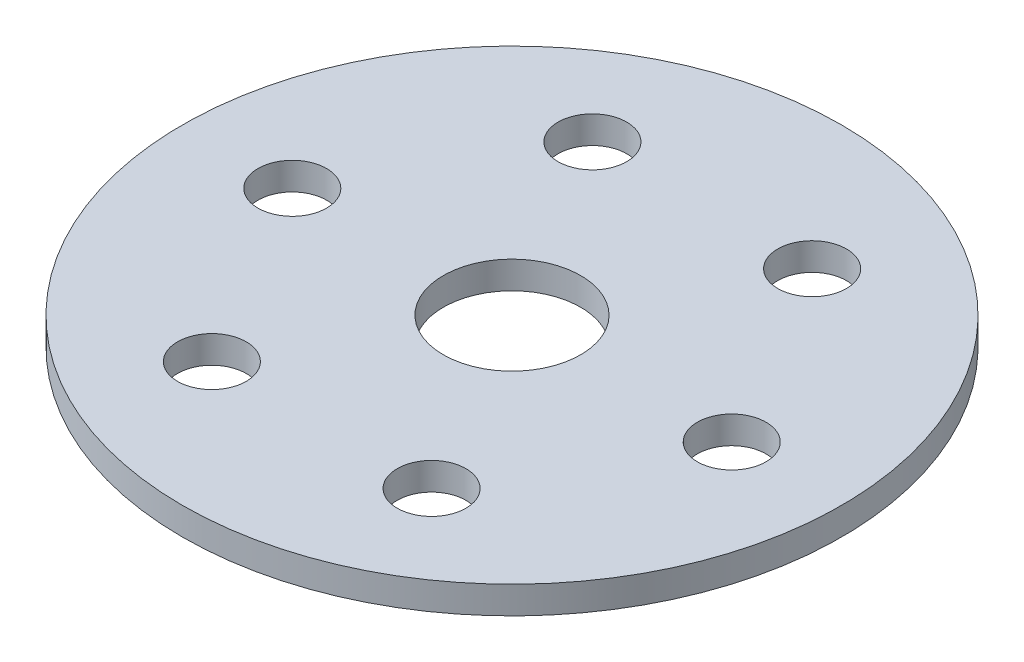
ISO-10303-21;
HEADER;
FILE_DESCRIPTION(('STEP AP214'),'2;1');
FILE_NAME('part.step','',(''),(''),'','','');
FILE_SCHEMA(('AUTOMOTIVE_DESIGN { 1 0 10303 214 1 1 1 1 }'));
ENDSEC;
DATA;
#1=APPLICATION_CONTEXT('core data for automotive mechanical design processes');
#2=APPLICATION_PROTOCOL_DEFINITION('international standard','automotive_design',2000,#1);
#3=PRODUCT_CONTEXT('',#1,'mechanical');
#4=PRODUCT('Part','Part','',(#3));
#5=PRODUCT_RELATED_PRODUCT_CATEGORY('part','',(#4));
#6=PRODUCT_DEFINITION_FORMATION('','',#4);
#7=PRODUCT_DEFINITION_CONTEXT('part definition',#1,'design');
#8=PRODUCT_DEFINITION('design','',#6,#7);
#9=PRODUCT_DEFINITION_SHAPE('','',#8);
#10=(LENGTH_UNIT() NAMED_UNIT(*) SI_UNIT(.MILLI.,.METRE.));
#11=(NAMED_UNIT(*) PLANE_ANGLE_UNIT() SI_UNIT($,.RADIAN.));
#12=(NAMED_UNIT(*) SI_UNIT($,.STERADIAN.) SOLID_ANGLE_UNIT());
#13=UNCERTAINTY_MEASURE_WITH_UNIT(LENGTH_MEASURE(1.E-05),#10,'distance_accuracy_value','');
#14=(GEOMETRIC_REPRESENTATION_CONTEXT(3) GLOBAL_UNCERTAINTY_ASSIGNED_CONTEXT((#13)) GLOBAL_UNIT_ASSIGNED_CONTEXT((#10,
#11,#12)) REPRESENTATION_CONTEXT('',''));
#15=CARTESIAN_POINT('',(0.,0.,0.));
#16=DIRECTION('',(0.,0.,1.));
#17=DIRECTION('',(1.,0.,0.));
#18=AXIS2_PLACEMENT_3D('',#15,#16,#17);
#19=CARTESIAN_POINT('',(0.,6.35,0.));
#20=DIRECTION('',(0.,1.,0.));
#21=DIRECTION('',(0.,0.,1.));
#22=AXIS2_PLACEMENT_3D('',#19,#20,#21);
#23=PLANE('',#22);
#24=CARTESIAN_POINT('',(-25.4000000000005,6.35,-43.9940905122492));
#25=DIRECTION('',(0.,1.,0.));
#26=DIRECTION('',(0.,0.,1.));
#27=AXIS2_PLACEMENT_3D('',#24,#25,#26);
#28=CIRCLE('',#27,7.9375);
#29=CARTESIAN_POINT('',(-25.4000000000005,6.35,-36.0565905122492));
#30=VERTEX_POINT('',#29);
#31=EDGE_CURVE('E83',#30,#30,#28,.T.);
#32=ORIENTED_EDGE('',*,*,#31,.F.);
#33=EDGE_LOOP('',(#32));
#34=FACE_BOUND('',#33,.T.);
#35=CARTESIAN_POINT('',(25.3999999999996,6.35,-43.9940905122497));
#36=DIRECTION('',(0.,1.,0.));
#37=DIRECTION('',(0.,0.,1.));
#38=AXIS2_PLACEMENT_3D('',#35,#36,#37);
#39=CIRCLE('',#38,7.9375);
#40=CARTESIAN_POINT('',(25.3999999999996,6.35,-36.0565905122497));
#41=VERTEX_POINT('',#40);
#42=EDGE_CURVE('E77',#41,#41,#39,.T.);
#43=ORIENTED_EDGE('',*,*,#42,.F.);
#44=EDGE_LOOP('',(#43));
#45=FACE_BOUND('',#44,.T.);
#46=CARTESIAN_POINT('',(50.8,6.35,0.));
#47=DIRECTION('',(0.,1.,0.));
#48=DIRECTION('',(0.,0.,1.));
#49=AXIS2_PLACEMENT_3D('',#46,#47,#48);
#50=CIRCLE('',#49,7.9375);
#51=CARTESIAN_POINT('',(50.8,6.35,7.9375));
#52=VERTEX_POINT('',#51);
#53=EDGE_CURVE('E71',#52,#52,#50,.T.);
#54=ORIENTED_EDGE('',*,*,#53,.F.);
#55=EDGE_LOOP('',(#54));
#56=FACE_BOUND('',#55,.T.);
#57=CARTESIAN_POINT('',(25.4000000000002,6.35,43.9940905122494));
#58=DIRECTION('',(0.,1.,0.));
#59=DIRECTION('',(0.,0.,1.));
#60=AXIS2_PLACEMENT_3D('',#57,#58,#59);
#61=CIRCLE('',#60,7.9375);
#62=CARTESIAN_POINT('',(25.4000000000002,6.35,51.9315905122494));
#63=VERTEX_POINT('',#62);
#64=EDGE_CURVE('E65',#63,#63,#61,.T.);
#65=ORIENTED_EDGE('',*,*,#64,.F.);
#66=EDGE_LOOP('',(#65));
#67=FACE_BOUND('',#66,.T.);
#68=CARTESIAN_POINT('',(-25.3999999999999,6.35,43.9940905122495));
#69=DIRECTION('',(0.,1.,0.));
#70=DIRECTION('',(0.,0.,1.));
#71=AXIS2_PLACEMENT_3D('',#68,#69,#70);
#72=CIRCLE('',#71,7.9375);
#73=CARTESIAN_POINT('',(-25.3999999999999,6.35,51.9315905122495));
#74=VERTEX_POINT('',#73);
#75=EDGE_CURVE('E59',#74,#74,#72,.T.);
#76=ORIENTED_EDGE('',*,*,#75,.F.);
#77=EDGE_LOOP('',(#76));
#78=FACE_BOUND('',#77,.T.);
#79=CARTESIAN_POINT('',(-50.8,6.35,0.));
#80=DIRECTION('',(0.,1.,0.));
#81=DIRECTION('',(0.,0.,1.));
#82=AXIS2_PLACEMENT_3D('',#79,#80,#81);
#83=CIRCLE('',#82,7.9375);
#84=CARTESIAN_POINT('',(-50.8,6.35,7.9375));
#85=VERTEX_POINT('',#84);
#86=EDGE_CURVE('E53',#85,#85,#83,.T.);
#87=ORIENTED_EDGE('',*,*,#86,.F.);
#88=EDGE_LOOP('',(#87));
#89=FACE_BOUND('',#88,.T.);
#90=CARTESIAN_POINT('',(0.,6.35,0.));
#91=DIRECTION('',(0.,1.,0.));
#92=DIRECTION('',(0.,0.,1.));
#93=AXIS2_PLACEMENT_3D('',#90,#91,#92);
#94=CIRCLE('',#93,76.2);
#95=CARTESIAN_POINT('',(0.,6.35,76.2));
#96=VERTEX_POINT('',#95);
#97=EDGE_CURVE('E10',#96,#96,#94,.T.);
#98=ORIENTED_EDGE('',*,*,#97,.T.);
#99=EDGE_LOOP('',(#98));
#100=FACE_BOUND('',#99,.T.);
#101=CARTESIAN_POINT('',(0.,6.35,0.));
#102=DIRECTION('',(0.,1.,0.));
#103=DIRECTION('',(0.,0.,1.));
#104=AXIS2_PLACEMENT_3D('',#101,#102,#103);
#105=CIRCLE('',#104,15.875);
#106=CARTESIAN_POINT('',(0.,6.35,15.875));
#107=VERTEX_POINT('',#106);
#108=EDGE_CURVE('E43',#107,#107,#105,.T.);
#109=ORIENTED_EDGE('',*,*,#108,.F.);
#110=EDGE_LOOP('',(#109));
#111=FACE_BOUND('',#110,.T.);
#112=ADVANCED_FACE('F32',(#34,#45,#56,#67,#78,#89,#100,#111),#23,.T.);
#113=CARTESIAN_POINT('',(0.,0.,0.));
#114=DIRECTION('',(0.,1.,0.));
#115=DIRECTION('',(0.,0.,1.));
#116=AXIS2_PLACEMENT_3D('',#113,#114,#115);
#117=PLANE('',#116);
#118=CARTESIAN_POINT('',(-25.4000000000005,0.,-43.9940905122492));
#119=DIRECTION('',(0.,1.,0.));
#120=DIRECTION('',(0.,0.,1.));
#121=AXIS2_PLACEMENT_3D('',#118,#119,#120);
#122=CIRCLE('',#121,7.9375);
#123=CARTESIAN_POINT('',(-25.4000000000005,0.,-36.0565905122492));
#124=VERTEX_POINT('',#123);
#125=EDGE_CURVE('E80',#124,#124,#122,.T.);
#126=ORIENTED_EDGE('',*,*,#125,.T.);
#127=EDGE_LOOP('',(#126));
#128=FACE_BOUND('',#127,.T.);
#129=CARTESIAN_POINT('',(25.3999999999996,0.,-43.9940905122497));
#130=DIRECTION('',(0.,1.,0.));
#131=DIRECTION('',(0.,0.,1.));
#132=AXIS2_PLACEMENT_3D('',#129,#130,#131);
#133=CIRCLE('',#132,7.9375);
#134=CARTESIAN_POINT('',(25.3999999999996,0.,-36.0565905122497));
#135=VERTEX_POINT('',#134);
#136=EDGE_CURVE('E74',#135,#135,#133,.T.);
#137=ORIENTED_EDGE('',*,*,#136,.T.);
#138=EDGE_LOOP('',(#137));
#139=FACE_BOUND('',#138,.T.);
#140=CARTESIAN_POINT('',(50.8,0.,0.));
#141=DIRECTION('',(0.,1.,0.));
#142=DIRECTION('',(0.,0.,1.));
#143=AXIS2_PLACEMENT_3D('',#140,#141,#142);
#144=CIRCLE('',#143,7.9375);
#145=CARTESIAN_POINT('',(50.8,0.,7.9375));
#146=VERTEX_POINT('',#145);
#147=EDGE_CURVE('E68',#146,#146,#144,.T.);
#148=ORIENTED_EDGE('',*,*,#147,.T.);
#149=EDGE_LOOP('',(#148));
#150=FACE_BOUND('',#149,.T.);
#151=CARTESIAN_POINT('',(25.4000000000002,0.,43.9940905122494));
#152=DIRECTION('',(0.,1.,0.));
#153=DIRECTION('',(0.,0.,1.));
#154=AXIS2_PLACEMENT_3D('',#151,#152,#153);
#155=CIRCLE('',#154,7.9375);
#156=CARTESIAN_POINT('',(25.4000000000002,0.,51.9315905122494));
#157=VERTEX_POINT('',#156);
#158=EDGE_CURVE('E62',#157,#157,#155,.T.);
#159=ORIENTED_EDGE('',*,*,#158,.T.);
#160=EDGE_LOOP('',(#159));
#161=FACE_BOUND('',#160,.T.);
#162=CARTESIAN_POINT('',(-25.3999999999999,0.,43.9940905122495));
#163=DIRECTION('',(0.,1.,0.));
#164=DIRECTION('',(0.,0.,1.));
#165=AXIS2_PLACEMENT_3D('',#162,#163,#164);
#166=CIRCLE('',#165,7.9375);
#167=CARTESIAN_POINT('',(-25.3999999999999,0.,51.9315905122495));
#168=VERTEX_POINT('',#167);
#169=EDGE_CURVE('E56',#168,#168,#166,.T.);
#170=ORIENTED_EDGE('',*,*,#169,.T.);
#171=EDGE_LOOP('',(#170));
#172=FACE_BOUND('',#171,.T.);
#173=CARTESIAN_POINT('',(-50.8,0.,0.));
#174=DIRECTION('',(0.,1.,0.));
#175=DIRECTION('',(0.,0.,1.));
#176=AXIS2_PLACEMENT_3D('',#173,#174,#175);
#177=CIRCLE('',#176,7.9375);
#178=CARTESIAN_POINT('',(-50.8,0.,7.9375));
#179=VERTEX_POINT('',#178);
#180=EDGE_CURVE('E48',#179,#179,#177,.T.);
#181=ORIENTED_EDGE('',*,*,#180,.T.);
#182=EDGE_LOOP('',(#181));
#183=FACE_BOUND('',#182,.T.);
#184=CARTESIAN_POINT('',(0.,0.,0.));
#185=DIRECTION('',(0.,1.,0.));
#186=DIRECTION('',(0.,0.,1.));
#187=AXIS2_PLACEMENT_3D('',#184,#185,#186);
#188=CIRCLE('',#187,76.2);
#189=CARTESIAN_POINT('',(0.,0.,76.2));
#190=VERTEX_POINT('',#189);
#191=EDGE_CURVE('E36',#190,#190,#188,.T.);
#192=ORIENTED_EDGE('',*,*,#191,.F.);
#193=EDGE_LOOP('',(#192));
#194=FACE_BOUND('',#193,.T.);
#195=CARTESIAN_POINT('',(0.,0.,0.));
#196=DIRECTION('',(0.,1.,0.));
#197=DIRECTION('',(0.,0.,1.));
#198=AXIS2_PLACEMENT_3D('',#195,#196,#197);
#199=CIRCLE('',#198,15.875);
#200=CARTESIAN_POINT('',(0.,0.,15.875));
#201=VERTEX_POINT('',#200);
#202=EDGE_CURVE('E45',#201,#201,#199,.T.);
#203=ORIENTED_EDGE('',*,*,#202,.T.);
#204=EDGE_LOOP('',(#203));
#205=FACE_BOUND('',#204,.T.);
#206=ADVANCED_FACE('F91',(#128,#139,#150,#161,#172,#183,#194,#205),#117,.F.);
#207=CARTESIAN_POINT('',(0.,6.35,0.));
#208=DIRECTION('',(0.,-1.,0.));
#209=DIRECTION('',(0.,0.,-1.));
#210=AXIS2_PLACEMENT_3D('',#207,#208,#209);
#211=CYLINDRICAL_SURFACE('',#210,76.2);
#212=ORIENTED_EDGE('',*,*,#97,.F.);
#213=EDGE_LOOP('',(#212));
#214=FACE_BOUND('',#213,.T.);
#215=ORIENTED_EDGE('',*,*,#191,.T.);
#216=EDGE_LOOP('',(#215));
#217=FACE_BOUND('',#216,.T.);
#218=ADVANCED_FACE('F34',(#214,#217),#211,.T.);
#219=CARTESIAN_POINT('',(0.,6.35,0.));
#220=DIRECTION('',(0.,-1.,0.));
#221=DIRECTION('',(0.,0.,-1.));
#222=AXIS2_PLACEMENT_3D('',#219,#220,#221);
#223=CYLINDRICAL_SURFACE('',#222,15.875);
#224=ORIENTED_EDGE('',*,*,#108,.T.);
#225=EDGE_LOOP('',(#224));
#226=FACE_BOUND('',#225,.T.);
#227=ORIENTED_EDGE('',*,*,#202,.F.);
#228=EDGE_LOOP('',(#227));
#229=FACE_BOUND('',#228,.T.);
#230=ADVANCED_FACE('F105',(#226,#229),#223,.F.);
#231=CARTESIAN_POINT('',(-50.8,6.35,0.));
#232=DIRECTION('',(0.,1.,0.));
#233=DIRECTION('',(0.,0.,1.));
#234=AXIS2_PLACEMENT_3D('',#231,#232,#233);
#235=CYLINDRICAL_SURFACE('',#234,7.9375);
#236=ORIENTED_EDGE('',*,*,#180,.F.);
#237=EDGE_LOOP('',(#236));
#238=FACE_BOUND('',#237,.T.);
#239=ORIENTED_EDGE('',*,*,#86,.T.);
#240=EDGE_LOOP('',(#239));
#241=FACE_BOUND('',#240,.T.);
#242=ADVANCED_FACE('F108',(#238,#241),#235,.F.);
#243=CARTESIAN_POINT('',(-25.3999999999999,6.35,43.9940905122495));
#244=DIRECTION('',(0.,1.,0.));
#245=DIRECTION('',(0.,0.,1.));
#246=AXIS2_PLACEMENT_3D('',#243,#244,#245);
#247=CYLINDRICAL_SURFACE('',#246,7.9375);
#248=ORIENTED_EDGE('',*,*,#169,.F.);
#249=EDGE_LOOP('',(#248));
#250=FACE_BOUND('',#249,.T.);
#251=ORIENTED_EDGE('',*,*,#75,.T.);
#252=EDGE_LOOP('',(#251));
#253=FACE_BOUND('',#252,.T.);
#254=ADVANCED_FACE('F122',(#250,#253),#247,.F.);
#255=CARTESIAN_POINT('',(25.4000000000002,6.35,43.9940905122494));
#256=DIRECTION('',(0.,1.,0.));
#257=DIRECTION('',(0.,0.,1.));
#258=AXIS2_PLACEMENT_3D('',#255,#256,#257);
#259=CYLINDRICAL_SURFACE('',#258,7.9375);
#260=ORIENTED_EDGE('',*,*,#158,.F.);
#261=EDGE_LOOP('',(#260));
#262=FACE_BOUND('',#261,.T.);
#263=ORIENTED_EDGE('',*,*,#64,.T.);
#264=EDGE_LOOP('',(#263));
#265=FACE_BOUND('',#264,.T.);
#266=ADVANCED_FACE('F126',(#262,#265),#259,.F.);
#267=CARTESIAN_POINT('',(50.8,6.35,0.));
#268=DIRECTION('',(0.,1.,0.));
#269=DIRECTION('',(0.,0.,1.));
#270=AXIS2_PLACEMENT_3D('',#267,#268,#269);
#271=CYLINDRICAL_SURFACE('',#270,7.9375);
#272=ORIENTED_EDGE('',*,*,#147,.F.);
#273=EDGE_LOOP('',(#272));
#274=FACE_BOUND('',#273,.T.);
#275=ORIENTED_EDGE('',*,*,#53,.T.);
#276=EDGE_LOOP('',(#275));
#277=FACE_BOUND('',#276,.T.);
#278=ADVANCED_FACE('F130',(#274,#277),#271,.F.);
#279=CARTESIAN_POINT('',(25.3999999999996,6.35,-43.9940905122497));
#280=DIRECTION('',(0.,1.,0.));
#281=DIRECTION('',(0.,0.,1.));
#282=AXIS2_PLACEMENT_3D('',#279,#280,#281);
#283=CYLINDRICAL_SURFACE('',#282,7.9375);
#284=ORIENTED_EDGE('',*,*,#136,.F.);
#285=EDGE_LOOP('',(#284));
#286=FACE_BOUND('',#285,.T.);
#287=ORIENTED_EDGE('',*,*,#42,.T.);
#288=EDGE_LOOP('',(#287));
#289=FACE_BOUND('',#288,.T.);
#290=ADVANCED_FACE('F134',(#286,#289),#283,.F.);
#291=CARTESIAN_POINT('',(-25.4000000000005,6.35,-43.9940905122492));
#292=DIRECTION('',(0.,1.,0.));
#293=DIRECTION('',(0.,0.,1.));
#294=AXIS2_PLACEMENT_3D('',#291,#292,#293);
#295=CYLINDRICAL_SURFACE('',#294,7.9375);
#296=ORIENTED_EDGE('',*,*,#125,.F.);
#297=EDGE_LOOP('',(#296));
#298=FACE_BOUND('',#297,.T.);
#299=ORIENTED_EDGE('',*,*,#31,.T.);
#300=EDGE_LOOP('',(#299));
#301=FACE_BOUND('',#300,.T.);
#302=ADVANCED_FACE('F87',(#298,#301),#295,.F.);
#303=CLOSED_SHELL('',(#112,#206,#218,#230,#242,#254,#266,#278,#290,#302));
#304=MANIFOLD_SOLID_BREP('B2',#303);
#305=ADVANCED_BREP_SHAPE_REPRESENTATION('',(#18,#304),#14);
#306=SHAPE_DEFINITION_REPRESENTATION(#9,#305);
ENDSEC;
END-ISO-10303-21;
